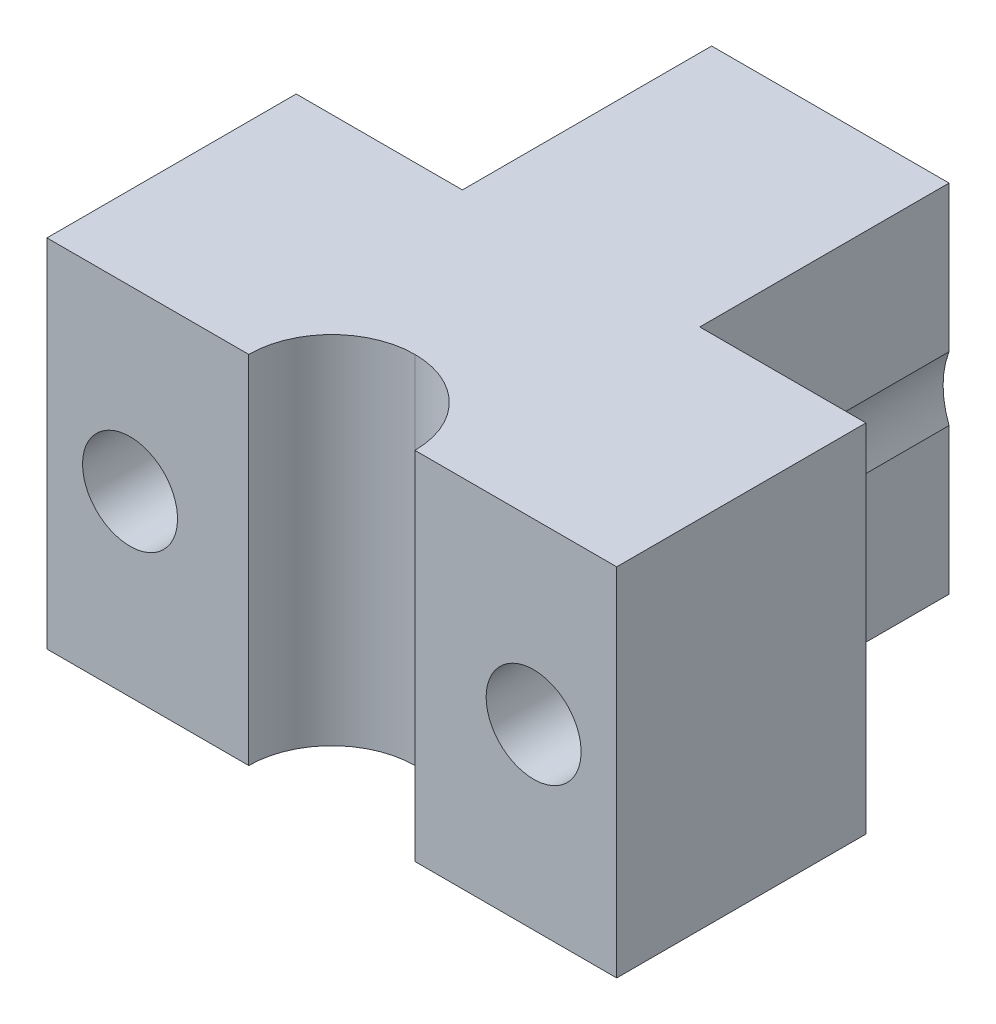
ISO-10303-21;
HEADER;
FILE_DESCRIPTION(('STEP AP214'),'2;1');
FILE_NAME('part.step','',(''),(''),'','','');
FILE_SCHEMA(('AUTOMOTIVE_DESIGN { 1 0 10303 214 1 1 1 1 }'));
ENDSEC;
DATA;
#1=APPLICATION_CONTEXT('core data for automotive mechanical design processes');
#2=APPLICATION_PROTOCOL_DEFINITION('international standard','automotive_design',2000,#1);
#3=PRODUCT_CONTEXT('',#1,'mechanical');
#4=PRODUCT('Part','Part','',(#3));
#5=PRODUCT_RELATED_PRODUCT_CATEGORY('part','',(#4));
#6=PRODUCT_DEFINITION_FORMATION('','',#4);
#7=PRODUCT_DEFINITION_CONTEXT('part definition',#1,'design');
#8=PRODUCT_DEFINITION('design','',#6,#7);
#9=PRODUCT_DEFINITION_SHAPE('','',#8);
#10=(LENGTH_UNIT() NAMED_UNIT(*) SI_UNIT(.MILLI.,.METRE.));
#11=(NAMED_UNIT(*) PLANE_ANGLE_UNIT() SI_UNIT($,.RADIAN.));
#12=(NAMED_UNIT(*) SI_UNIT($,.STERADIAN.) SOLID_ANGLE_UNIT());
#13=UNCERTAINTY_MEASURE_WITH_UNIT(LENGTH_MEASURE(1.E-05),#10,'distance_accuracy_value','');
#14=(GEOMETRIC_REPRESENTATION_CONTEXT(3) GLOBAL_UNCERTAINTY_ASSIGNED_CONTEXT((#13)) GLOBAL_UNIT_ASSIGNED_CONTEXT((#10,
#11,#12)) REPRESENTATION_CONTEXT('',''));
#15=CARTESIAN_POINT('',(0.,0.,0.));
#16=DIRECTION('',(0.,0.,1.));
#17=DIRECTION('',(1.,0.,0.));
#18=AXIS2_PLACEMENT_3D('',#15,#16,#17);
#19=CARTESIAN_POINT('',(-10.,0.,0.));
#20=DIRECTION('',(1.,0.,0.));
#21=DIRECTION('',(0.,0.,-1.));
#22=AXIS2_PLACEMENT_3D('',#19,#20,#21);
#23=PLANE('',#22);
#24=DIRECTION('',(0.,0.,1.));
#25=VECTOR('',#24,1.);
#26=CARTESIAN_POINT('',(-10.,17.6925824035673,-32.));
#27=LINE('',#26,#25);
#28=CARTESIAN_POINT('',(-10.,17.6925824035673,-11.));
#29=VERTEX_POINT('',#28);
#30=CARTESIAN_POINT('',(-10.,17.6925824035673,-16.3));
#31=VERTEX_POINT('',#30);
#32=EDGE_CURVE('E11',#29,#31,#27,.F.);
#33=ORIENTED_EDGE('',*,*,#32,.F.);
#34=DIRECTION('',(0.,1.,0.));
#35=VECTOR('',#34,1.);
#36=CARTESIAN_POINT('',(-10.,0.,-11.));
#37=LINE('',#36,#35);
#38=CARTESIAN_POINT('',(-10.,30.,-11.));
#39=VERTEX_POINT('',#38);
#40=EDGE_CURVE('E186',#29,#39,#37,.T.);
#41=ORIENTED_EDGE('',*,*,#40,.T.);
#42=DIRECTION('',(0.,0.,-1.));
#43=VECTOR('',#42,1.);
#44=CARTESIAN_POINT('',(-10.,30.,-11.));
#45=LINE('',#44,#43);
#46=CARTESIAN_POINT('',(-10.,30.,-32.));
#47=VERTEX_POINT('',#46);
#48=EDGE_CURVE('E198',#39,#47,#45,.T.);
#49=ORIENTED_EDGE('',*,*,#48,.T.);
#50=DIRECTION('',(0.,-1.,0.));
#51=VECTOR('',#50,1.);
#52=CARTESIAN_POINT('',(-10.,0.,-32.));
#53=LINE('',#52,#51);
#54=CARTESIAN_POINT('',(-10.,17.6925824035673,-32.));
#55=VERTEX_POINT('',#54);
#56=EDGE_CURVE('E206',#47,#55,#53,.T.);
#57=ORIENTED_EDGE('',*,*,#56,.T.);
#58=CARTESIAN_POINT('',(-10.,17.6925824035673,-26.7));
#59=VERTEX_POINT('',#58);
#60=EDGE_CURVE('E41',#59,#55,#27,.F.);
#61=ORIENTED_EDGE('',*,*,#60,.F.);
#62=DIRECTION('',(0.,-1.,0.));
#63=VECTOR('',#62,1.);
#64=CARTESIAN_POINT('',(-10.,4.8,-26.7));
#65=LINE('',#64,#63);
#66=CARTESIAN_POINT('',(-10.,25.2,-26.7));
#67=VERTEX_POINT('',#66);
#68=EDGE_CURVE('E352',#67,#59,#65,.T.);
#69=ORIENTED_EDGE('',*,*,#68,.F.);
#70=DIRECTION('',(0.,0.,-1.));
#71=VECTOR('',#70,1.);
#72=CARTESIAN_POINT('',(-10.,25.2,-16.3));
#73=LINE('',#72,#71);
#74=CARTESIAN_POINT('',(-10.,25.2,-16.3));
#75=VERTEX_POINT('',#74);
#76=EDGE_CURVE('E348',#75,#67,#73,.T.);
#77=ORIENTED_EDGE('',*,*,#76,.F.);
#78=DIRECTION('',(0.,1.,0.));
#79=VECTOR('',#78,1.);
#80=CARTESIAN_POINT('',(-10.,4.80000000000001,-16.3));
#81=LINE('',#80,#79);
#82=EDGE_CURVE('E189',#31,#75,#81,.T.);
#83=ORIENTED_EDGE('',*,*,#82,.F.);
#84=EDGE_LOOP('',(#33,#41,#49,#57,#61,#69,#77,#83));
#85=FACE_BOUND('',#84,.T.);
#86=ADVANCED_FACE('F37',(#85),#23,.F.);
#87=DIRECTION('',(0.,0.,1.));
#88=VECTOR('',#87,1.);
#89=CARTESIAN_POINT('',(-10.,12.3074175964327,-32.));
#90=LINE('',#89,#88);
#91=CARTESIAN_POINT('',(-10.,12.3074175964327,-32.));
#92=VERTEX_POINT('',#91);
#93=CARTESIAN_POINT('',(-10.,12.3074175964327,-26.7));
#94=VERTEX_POINT('',#93);
#95=EDGE_CURVE('E287',#92,#94,#90,.T.);
#96=ORIENTED_EDGE('',*,*,#95,.F.);
#97=CARTESIAN_POINT('',(-10.,0.,-32.));
#98=VERTEX_POINT('',#97);
#99=EDGE_CURVE('E205',#92,#98,#53,.T.);
#100=ORIENTED_EDGE('',*,*,#99,.T.);
#101=DIRECTION('',(0.,0.,1.));
#102=VECTOR('',#101,1.);
#103=CARTESIAN_POINT('',(-10.,0.,-11.));
#104=LINE('',#103,#102);
#105=CARTESIAN_POINT('',(-10.,0.,-11.));
#106=VERTEX_POINT('',#105);
#107=EDGE_CURVE('E196',#98,#106,#104,.T.);
#108=ORIENTED_EDGE('',*,*,#107,.T.);
#109=CARTESIAN_POINT('',(-10.,12.3074175964327,-11.));
#110=VERTEX_POINT('',#109);
#111=EDGE_CURVE('E195',#106,#110,#37,.T.);
#112=ORIENTED_EDGE('',*,*,#111,.T.);
#113=CARTESIAN_POINT('',(-10.,12.3074175964327,-16.3));
#114=VERTEX_POINT('',#113);
#115=EDGE_CURVE('E181',#114,#110,#90,.T.);
#116=ORIENTED_EDGE('',*,*,#115,.F.);
#117=CARTESIAN_POINT('',(-10.,4.80000000000001,-16.3));
#118=VERTEX_POINT('',#117);
#119=EDGE_CURVE('E345',#118,#114,#81,.T.);
#120=ORIENTED_EDGE('',*,*,#119,.F.);
#121=DIRECTION('',(0.,0.,1.));
#122=VECTOR('',#121,1.);
#123=CARTESIAN_POINT('',(-10.,4.80000000000001,-16.3));
#124=LINE('',#123,#122);
#125=CARTESIAN_POINT('',(-10.,4.8,-26.7));
#126=VERTEX_POINT('',#125);
#127=EDGE_CURVE('E340',#126,#118,#124,.T.);
#128=ORIENTED_EDGE('',*,*,#127,.F.);
#129=EDGE_CURVE('E351',#94,#126,#65,.T.);
#130=ORIENTED_EDGE('',*,*,#129,.F.);
#131=EDGE_LOOP('',(#96,#100,#108,#112,#116,#120,#128,#130));
#132=FACE_BOUND('',#131,.T.);
#133=ADVANCED_FACE('F373',(#132),#23,.F.);
#134=CARTESIAN_POINT('',(10.,0.,0.));
#135=DIRECTION('',(1.,0.,0.));
#136=DIRECTION('',(0.,0.,-1.));
#137=AXIS2_PLACEMENT_3D('',#134,#135,#136);
#138=PLANE('',#137);
#139=DIRECTION('',(0.,-1.,0.));
#140=VECTOR('',#139,1.);
#141=CARTESIAN_POINT('',(10.,0.,-11.));
#142=LINE('',#141,#140);
#143=CARTESIAN_POINT('',(10.,30.,-11.));
#144=VERTEX_POINT('',#143);
#145=CARTESIAN_POINT('',(10.,17.6925824035672,-11.));
#146=VERTEX_POINT('',#145);
#147=EDGE_CURVE('E225',#144,#146,#142,.T.);
#148=ORIENTED_EDGE('',*,*,#147,.T.);
#149=DIRECTION('',(0.,0.,1.));
#150=VECTOR('',#149,1.);
#151=CARTESIAN_POINT('',(10.,17.6925824035672,-32.));
#152=LINE('',#151,#150);
#153=CARTESIAN_POINT('',(10.,17.6925824035672,-32.));
#154=VERTEX_POINT('',#153);
#155=EDGE_CURVE('E285',#146,#154,#152,.F.);
#156=ORIENTED_EDGE('',*,*,#155,.T.);
#157=DIRECTION('',(0.,1.,0.));
#158=VECTOR('',#157,1.);
#159=CARTESIAN_POINT('',(10.,0.,-32.));
#160=LINE('',#159,#158);
#161=CARTESIAN_POINT('',(10.,30.,-32.));
#162=VERTEX_POINT('',#161);
#163=EDGE_CURVE('E218',#154,#162,#160,.T.);
#164=ORIENTED_EDGE('',*,*,#163,.T.);
#165=DIRECTION('',(0.,0.,1.));
#166=VECTOR('',#165,1.);
#167=CARTESIAN_POINT('',(10.,30.,-11.));
#168=LINE('',#167,#166);
#169=EDGE_CURVE('E222',#162,#144,#168,.T.);
#170=ORIENTED_EDGE('',*,*,#169,.T.);
#171=EDGE_LOOP('',(#148,#156,#164,#170));
#172=FACE_BOUND('',#171,.T.);
#173=ADVANCED_FACE('F312',(#172),#138,.T.);
#174=CARTESIAN_POINT('',(10.,0.,-32.));
#175=VERTEX_POINT('',#174);
#176=CARTESIAN_POINT('',(10.,12.3074175964328,-32.));
#177=VERTEX_POINT('',#176);
#178=EDGE_CURVE('E219',#175,#177,#160,.T.);
#179=ORIENTED_EDGE('',*,*,#178,.T.);
#180=DIRECTION('',(0.,0.,1.));
#181=VECTOR('',#180,1.);
#182=CARTESIAN_POINT('',(10.,12.3074175964328,-32.));
#183=LINE('',#182,#181);
#184=CARTESIAN_POINT('',(10.,12.3074175964328,-11.));
#185=VERTEX_POINT('',#184);
#186=EDGE_CURVE('E277',#177,#185,#183,.T.);
#187=ORIENTED_EDGE('',*,*,#186,.T.);
#188=CARTESIAN_POINT('',(10.,0.,-11.));
#189=VERTEX_POINT('',#188);
#190=EDGE_CURVE('E224',#185,#189,#142,.T.);
#191=ORIENTED_EDGE('',*,*,#190,.T.);
#192=DIRECTION('',(0.,0.,-1.));
#193=VECTOR('',#192,1.);
#194=CARTESIAN_POINT('',(10.,0.,-11.));
#195=LINE('',#194,#193);
#196=EDGE_CURVE('E215',#189,#175,#195,.T.);
#197=ORIENTED_EDGE('',*,*,#196,.T.);
#198=EDGE_LOOP('',(#179,#187,#191,#197));
#199=FACE_BOUND('',#198,.T.);
#200=ADVANCED_FACE('F412',(#199),#138,.T.);
#201=CARTESIAN_POINT('',(24.,4.80000000000001,-16.3));
#202=DIRECTION('',(0.,-1.,0.));
#203=DIRECTION('',(0.,0.,-1.));
#204=AXIS2_PLACEMENT_3D('',#201,#202,#203);
#205=PLANE('',#204);
#206=DIRECTION('',(0.,0.,-1.));
#207=VECTOR('',#206,1.);
#208=CARTESIAN_POINT('',(6.,4.8,-26.7));
#209=LINE('',#208,#207);
#210=CARTESIAN_POINT('',(6.,4.80000000000001,-16.3));
#211=VERTEX_POINT('',#210);
#212=CARTESIAN_POINT('',(6.,4.8,-26.7));
#213=VERTEX_POINT('',#212);
#214=EDGE_CURVE('E320',#211,#213,#209,.T.);
#215=ORIENTED_EDGE('',*,*,#214,.T.);
#216=DIRECTION('',(-1.,0.,0.));
#217=VECTOR('',#216,1.);
#218=CARTESIAN_POINT('',(24.,4.8,-26.7));
#219=LINE('',#218,#217);
#220=EDGE_CURVE('E211',#213,#126,#219,.T.);
#221=ORIENTED_EDGE('',*,*,#220,.T.);
#222=ORIENTED_EDGE('',*,*,#127,.T.);
#223=DIRECTION('',(-1.,0.,0.));
#224=VECTOR('',#223,1.);
#225=CARTESIAN_POINT('',(24.,4.80000000000001,-16.3));
#226=LINE('',#225,#224);
#227=EDGE_CURVE('E354',#211,#118,#226,.T.);
#228=ORIENTED_EDGE('',*,*,#227,.F.);
#229=EDGE_LOOP('',(#215,#221,#222,#228));
#230=FACE_BOUND('',#229,.T.);
#231=ADVANCED_FACE('F369',(#230),#205,.F.);
#232=CARTESIAN_POINT('',(24.,4.8,-26.7));
#233=DIRECTION('',(0.,0.,-1.));
#234=DIRECTION('',(-1.,0.,0.));
#235=AXIS2_PLACEMENT_3D('',#232,#233,#234);
#236=PLANE('',#235);
#237=CARTESIAN_POINT('',(-17.,15.,-26.7));
#238=DIRECTION('',(0.,0.,-1.));
#239=DIRECTION('',(-1.,0.,0.));
#240=AXIS2_PLACEMENT_3D('',#237,#238,#239);
#241=CIRCLE('',#240,7.5);
#242=EDGE_CURVE('E291',#94,#59,#241,.F.);
#243=ORIENTED_EDGE('',*,*,#242,.F.);
#244=ORIENTED_EDGE('',*,*,#129,.T.);
#245=ORIENTED_EDGE('',*,*,#220,.F.);
#246=DIRECTION('',(0.,1.,0.));
#247=VECTOR('',#246,1.);
#248=CARTESIAN_POINT('',(6.,4.8,-26.7));
#249=LINE('',#248,#247);
#250=CARTESIAN_POINT('',(6.,25.2,-26.7));
#251=VERTEX_POINT('',#250);
#252=EDGE_CURVE('E327',#213,#251,#249,.T.);
#253=ORIENTED_EDGE('',*,*,#252,.T.);
#254=DIRECTION('',(-1.,0.,0.));
#255=VECTOR('',#254,1.);
#256=CARTESIAN_POINT('',(24.,25.2,-26.7));
#257=LINE('',#256,#255);
#258=EDGE_CURVE('E357',#251,#67,#257,.T.);
#259=ORIENTED_EDGE('',*,*,#258,.T.);
#260=ORIENTED_EDGE('',*,*,#68,.T.);
#261=EDGE_LOOP('',(#243,#244,#245,#253,#259,#260));
#262=FACE_BOUND('',#261,.T.);
#263=ADVANCED_FACE('F419',(#262),#236,.F.);
#264=CARTESIAN_POINT('',(24.,25.2,-16.3));
#265=DIRECTION('',(0.,1.,0.));
#266=DIRECTION('',(0.,0.,1.));
#267=AXIS2_PLACEMENT_3D('',#264,#265,#266);
#268=PLANE('',#267);
#269=DIRECTION('',(0.,0.,1.));
#270=VECTOR('',#269,1.);
#271=CARTESIAN_POINT('',(6.,25.2,-26.7));
#272=LINE('',#271,#270);
#273=CARTESIAN_POINT('',(6.,25.2,-16.3));
#274=VERTEX_POINT('',#273);
#275=EDGE_CURVE('E282',#251,#274,#272,.T.);
#276=ORIENTED_EDGE('',*,*,#275,.T.);
#277=DIRECTION('',(-1.,0.,0.));
#278=VECTOR('',#277,1.);
#279=CARTESIAN_POINT('',(24.,25.2,-16.3));
#280=LINE('',#279,#278);
#281=EDGE_CURVE('E359',#274,#75,#280,.T.);
#282=ORIENTED_EDGE('',*,*,#281,.T.);
#283=ORIENTED_EDGE('',*,*,#76,.T.);
#284=ORIENTED_EDGE('',*,*,#258,.F.);
#285=EDGE_LOOP('',(#276,#282,#283,#284));
#286=FACE_BOUND('',#285,.T.);
#287=ADVANCED_FACE('F474',(#286),#268,.F.);
#288=CARTESIAN_POINT('',(24.,4.80000000000001,-16.3));
#289=DIRECTION('',(0.,0.,1.));
#290=DIRECTION('',(1.,0.,0.));
#291=AXIS2_PLACEMENT_3D('',#288,#289,#290);
#292=PLANE('',#291);
#293=CARTESIAN_POINT('',(-17.,15.,-16.3));
#294=DIRECTION('',(0.,0.,1.));
#295=DIRECTION('',(1.,0.,0.));
#296=AXIS2_PLACEMENT_3D('',#293,#294,#295);
#297=CIRCLE('',#296,7.5);
#298=EDGE_CURVE('E300',#31,#114,#297,.F.);
#299=ORIENTED_EDGE('',*,*,#298,.F.);
#300=ORIENTED_EDGE('',*,*,#82,.T.);
#301=ORIENTED_EDGE('',*,*,#281,.F.);
#302=DIRECTION('',(0.,-1.,0.));
#303=VECTOR('',#302,1.);
#304=CARTESIAN_POINT('',(6.,4.8,-16.3));
#305=LINE('',#304,#303);
#306=EDGE_CURVE('E318',#274,#211,#305,.T.);
#307=ORIENTED_EDGE('',*,*,#306,.T.);
#308=ORIENTED_EDGE('',*,*,#227,.T.);
#309=ORIENTED_EDGE('',*,*,#119,.T.);
#310=EDGE_LOOP('',(#299,#300,#301,#307,#308,#309));
#311=FACE_BOUND('',#310,.T.);
#312=ADVANCED_FACE('F363',(#311),#292,.F.);
#313=CARTESIAN_POINT('',(-24.,0.,-32.));
#314=DIRECTION('',(0.,0.,1.));
#315=DIRECTION('',(1.,0.,0.));
#316=AXIS2_PLACEMENT_3D('',#313,#314,#315);
#317=PLANE('',#316);
#318=CARTESIAN_POINT('',(-17.,15.,-32.));
#319=DIRECTION('',(0.,0.,-1.));
#320=DIRECTION('',(-1.,0.,0.));
#321=AXIS2_PLACEMENT_3D('',#318,#319,#320);
#322=CIRCLE('',#321,7.5);
#323=EDGE_CURVE('E52',#55,#92,#322,.T.);
#324=ORIENTED_EDGE('',*,*,#323,.F.);
#325=ORIENTED_EDGE('',*,*,#56,.F.);
#326=DIRECTION('',(1.,0.,0.));
#327=VECTOR('',#326,1.);
#328=CARTESIAN_POINT('',(-24.,30.,-32.));
#329=LINE('',#328,#327);
#330=EDGE_CURVE('E235',#47,#162,#329,.T.);
#331=ORIENTED_EDGE('',*,*,#330,.T.);
#332=ORIENTED_EDGE('',*,*,#163,.F.);
#333=CARTESIAN_POINT('',(17.,15.,-32.));
#334=DIRECTION('',(0.,0.,-1.));
#335=DIRECTION('',(-1.,0.,0.));
#336=AXIS2_PLACEMENT_3D('',#333,#334,#335);
#337=CIRCLE('',#336,7.5);
#338=EDGE_CURVE('E310',#177,#154,#337,.T.);
#339=ORIENTED_EDGE('',*,*,#338,.F.);
#340=ORIENTED_EDGE('',*,*,#178,.F.);
#341=DIRECTION('',(1.,0.,0.));
#342=VECTOR('',#341,1.);
#343=CARTESIAN_POINT('',(-24.,0.,-32.));
#344=LINE('',#343,#342);
#345=EDGE_CURVE('E233',#98,#175,#344,.T.);
#346=ORIENTED_EDGE('',*,*,#345,.F.);
#347=ORIENTED_EDGE('',*,*,#99,.F.);
#348=EDGE_LOOP('',(#324,#325,#331,#332,#339,#340,#346,#347));
#349=FACE_BOUND('',#348,.T.);
#350=ADVANCED_FACE('F297',(#349),#317,.F.);
#351=CARTESIAN_POINT('',(-24.,30.,10.));
#352=DIRECTION('',(0.,0.,-1.));
#353=DIRECTION('',(-1.,0.,0.));
#354=AXIS2_PLACEMENT_3D('',#351,#352,#353);
#355=PLANE('',#354);
#356=CARTESIAN_POINT('',(17.,15.,10.));
#357=DIRECTION('',(0.,0.,-1.));
#358=DIRECTION('',(-1.,0.,0.));
#359=AXIS2_PLACEMENT_3D('',#356,#357,#358);
#360=CIRCLE('',#359,4.);
#361=CARTESIAN_POINT('',(13.,15.,10.));
#362=VERTEX_POINT('',#361);
#363=EDGE_CURVE('E331',#362,#362,#360,.T.);
#364=ORIENTED_EDGE('',*,*,#363,.T.);
#365=EDGE_LOOP('',(#364));
#366=FACE_BOUND('',#365,.T.);
#367=DIRECTION('',(1.,0.,0.));
#368=VECTOR('',#367,1.);
#369=CARTESIAN_POINT('',(-24.,30.,10.));
#370=LINE('',#369,#368);
#371=CARTESIAN_POINT('',(7.,30.,10.));
#372=VERTEX_POINT('',#371);
#373=CARTESIAN_POINT('',(24.,30.,10.));
#374=VERTEX_POINT('',#373);
#375=EDGE_CURVE('E252',#372,#374,#370,.T.);
#376=ORIENTED_EDGE('',*,*,#375,.F.);
#377=DIRECTION('',(0.,1.,0.));
#378=VECTOR('',#377,1.);
#379=CARTESIAN_POINT('',(7.,0.,10.));
#380=LINE('',#379,#378);
#381=CARTESIAN_POINT('',(7.,0.,10.));
#382=VERTEX_POINT('',#381);
#383=EDGE_CURVE('E242',#382,#372,#380,.T.);
#384=ORIENTED_EDGE('',*,*,#383,.F.);
#385=DIRECTION('',(1.,0.,0.));
#386=VECTOR('',#385,1.);
#387=CARTESIAN_POINT('',(-24.,0.,10.));
#388=LINE('',#387,#386);
#389=CARTESIAN_POINT('',(24.,0.,10.));
#390=VERTEX_POINT('',#389);
#391=EDGE_CURVE('E261',#382,#390,#388,.T.);
#392=ORIENTED_EDGE('',*,*,#391,.T.);
#393=DIRECTION('',(0.,-1.,0.));
#394=VECTOR('',#393,1.);
#395=CARTESIAN_POINT('',(24.,30.,10.));
#396=LINE('',#395,#394);
#397=EDGE_CURVE('E256',#374,#390,#396,.T.);
#398=ORIENTED_EDGE('',*,*,#397,.F.);
#399=EDGE_LOOP('',(#376,#384,#392,#398));
#400=FACE_BOUND('',#399,.T.);
#401=ADVANCED_FACE('F398',(#366,#400),#355,.F.);
#402=CARTESIAN_POINT('',(24.,30.,10.));
#403=DIRECTION('',(-1.,0.,0.));
#404=DIRECTION('',(0.,0.,1.));
#405=AXIS2_PLACEMENT_3D('',#402,#403,#404);
#406=PLANE('',#405);
#407=DIRECTION('',(0.,0.,-1.));
#408=VECTOR('',#407,1.);
#409=CARTESIAN_POINT('',(24.,0.,10.));
#410=LINE('',#409,#408);
#411=CARTESIAN_POINT('',(24.,0.,-11.));
#412=VERTEX_POINT('',#411);
#413=EDGE_CURVE('E245',#390,#412,#410,.T.);
#414=ORIENTED_EDGE('',*,*,#413,.T.);
#415=DIRECTION('',(0.,-1.,0.));
#416=VECTOR('',#415,1.);
#417=CARTESIAN_POINT('',(24.,0.,-11.));
#418=LINE('',#417,#416);
#419=CARTESIAN_POINT('',(24.,30.,-11.));
#420=VERTEX_POINT('',#419);
#421=EDGE_CURVE('E213',#420,#412,#418,.T.);
#422=ORIENTED_EDGE('',*,*,#421,.F.);
#423=DIRECTION('',(0.,0.,-1.));
#424=VECTOR('',#423,1.);
#425=CARTESIAN_POINT('',(24.,30.,10.));
#426=LINE('',#425,#424);
#427=EDGE_CURVE('E246',#374,#420,#426,.T.);
#428=ORIENTED_EDGE('',*,*,#427,.F.);
#429=ORIENTED_EDGE('',*,*,#397,.T.);
#430=EDGE_LOOP('',(#414,#422,#428,#429));
#431=FACE_BOUND('',#430,.T.);
#432=ADVANCED_FACE('F405',(#431),#406,.F.);
#433=CARTESIAN_POINT('',(-24.,30.,10.));
#434=DIRECTION('',(1.,0.,0.));
#435=DIRECTION('',(0.,0.,-1.));
#436=AXIS2_PLACEMENT_3D('',#433,#434,#435);
#437=PLANE('',#436);
#438=DIRECTION('',(0.,0.,1.));
#439=VECTOR('',#438,1.);
#440=CARTESIAN_POINT('',(-24.,30.,10.));
#441=LINE('',#440,#439);
#442=CARTESIAN_POINT('',(-24.,30.,-11.));
#443=VERTEX_POINT('',#442);
#444=CARTESIAN_POINT('',(-24.,30.,10.));
#445=VERTEX_POINT('',#444);
#446=EDGE_CURVE('E249',#443,#445,#441,.T.);
#447=ORIENTED_EDGE('',*,*,#446,.F.);
#448=DIRECTION('',(0.,1.,0.));
#449=VECTOR('',#448,1.);
#450=CARTESIAN_POINT('',(-24.,0.,-11.));
#451=LINE('',#450,#449);
#452=CARTESIAN_POINT('',(-24.,0.,-11.));
#453=VERTEX_POINT('',#452);
#454=EDGE_CURVE('E200',#453,#443,#451,.T.);
#455=ORIENTED_EDGE('',*,*,#454,.F.);
#456=DIRECTION('',(0.,0.,1.));
#457=VECTOR('',#456,1.);
#458=CARTESIAN_POINT('',(-24.,0.,10.));
#459=LINE('',#458,#457);
#460=CARTESIAN_POINT('',(-24.,0.,10.));
#461=VERTEX_POINT('',#460);
#462=EDGE_CURVE('E259',#453,#461,#459,.T.);
#463=ORIENTED_EDGE('',*,*,#462,.T.);
#464=DIRECTION('',(0.,-1.,0.));
#465=VECTOR('',#464,1.);
#466=CARTESIAN_POINT('',(-24.,30.,10.));
#467=LINE('',#466,#465);
#468=EDGE_CURVE('E266',#445,#461,#467,.T.);
#469=ORIENTED_EDGE('',*,*,#468,.F.);
#470=EDGE_LOOP('',(#447,#455,#463,#469));
#471=FACE_BOUND('',#470,.T.);
#472=ADVANCED_FACE('F380',(#471),#437,.F.);
#473=CARTESIAN_POINT('',(-17.,15.,10.));
#474=DIRECTION('',(0.,0.,-1.));
#475=DIRECTION('',(-1.,0.,0.));
#476=AXIS2_PLACEMENT_3D('',#473,#474,#475);
#477=CIRCLE('',#476,4.);
#478=CARTESIAN_POINT('',(-21.,15.,10.));
#479=VERTEX_POINT('',#478);
#480=EDGE_CURVE('E337',#479,#479,#477,.T.);
#481=ORIENTED_EDGE('',*,*,#480,.T.);
#482=EDGE_LOOP('',(#481));
#483=FACE_BOUND('',#482,.T.);
#484=CARTESIAN_POINT('',(-7.,0.,10.));
#485=VERTEX_POINT('',#484);
#486=EDGE_CURVE('E250',#461,#485,#388,.T.);
#487=ORIENTED_EDGE('',*,*,#486,.T.);
#488=DIRECTION('',(0.,-1.,0.));
#489=VECTOR('',#488,1.);
#490=CARTESIAN_POINT('',(-7.00000000000001,30.,10.));
#491=LINE('',#490,#489);
#492=CARTESIAN_POINT('',(-7.00000000000001,30.,10.));
#493=VERTEX_POINT('',#492);
#494=EDGE_CURVE('E238',#493,#485,#491,.T.);
#495=ORIENTED_EDGE('',*,*,#494,.F.);
#496=EDGE_CURVE('E253',#445,#493,#370,.T.);
#497=ORIENTED_EDGE('',*,*,#496,.F.);
#498=ORIENTED_EDGE('',*,*,#468,.T.);
#499=EDGE_LOOP('',(#487,#495,#497,#498));
#500=FACE_BOUND('',#499,.T.);
#501=ADVANCED_FACE('F387',(#483,#500),#355,.F.);
#502=CARTESIAN_POINT('',(0.,30.,0.));
#503=DIRECTION('',(0.,-1.,0.));
#504=DIRECTION('',(0.,0.,-1.));
#505=AXIS2_PLACEMENT_3D('',#502,#503,#504);
#506=PLANE('',#505);
#507=ORIENTED_EDGE('',*,*,#48,.F.);
#508=DIRECTION('',(-1.,0.,0.));
#509=VECTOR('',#508,1.);
#510=CARTESIAN_POINT('',(-10.,30.,-11.));
#511=LINE('',#510,#509);
#512=EDGE_CURVE('E193',#39,#443,#511,.T.);
#513=ORIENTED_EDGE('',*,*,#512,.T.);
#514=ORIENTED_EDGE('',*,*,#446,.T.);
#515=ORIENTED_EDGE('',*,*,#496,.T.);
#516=CARTESIAN_POINT('',(0.,30.,10.));
#517=DIRECTION('',(0.,-1.,0.));
#518=DIRECTION('',(0.,0.,-1.));
#519=AXIS2_PLACEMENT_3D('',#516,#517,#518);
#520=CIRCLE('',#519,7.);
#521=CARTESIAN_POINT('',(0.,30.,3.));
#522=VERTEX_POINT('',#521);
#523=EDGE_CURVE('E271',#493,#522,#520,.T.);
#524=ORIENTED_EDGE('',*,*,#523,.T.);
#525=CARTESIAN_POINT('',(0.,30.,10.));
#526=DIRECTION('',(0.,-1.,0.));
#527=DIRECTION('',(0.,0.,-1.));
#528=AXIS2_PLACEMENT_3D('',#525,#526,#527);
#529=CIRCLE('',#528,7.);
#530=EDGE_CURVE('E273',#522,#372,#529,.T.);
#531=ORIENTED_EDGE('',*,*,#530,.T.);
#532=ORIENTED_EDGE('',*,*,#375,.T.);
#533=ORIENTED_EDGE('',*,*,#427,.T.);
#534=DIRECTION('',(1.,0.,0.));
#535=VECTOR('',#534,1.);
#536=CARTESIAN_POINT('',(10.,30.,-11.));
#537=LINE('',#536,#535);
#538=EDGE_CURVE('E228',#144,#420,#537,.T.);
#539=ORIENTED_EDGE('',*,*,#538,.F.);
#540=ORIENTED_EDGE('',*,*,#169,.F.);
#541=ORIENTED_EDGE('',*,*,#330,.F.);
#542=EDGE_LOOP('',(#507,#513,#514,#515,#524,#531,#532,#533,#539,#540,#541));
#543=FACE_BOUND('',#542,.T.);
#544=ADVANCED_FACE('F303',(#543),#506,.F.);
#545=CARTESIAN_POINT('',(0.,0.,0.));
#546=DIRECTION('',(0.,-1.,0.));
#547=DIRECTION('',(0.,0.,-1.));
#548=AXIS2_PLACEMENT_3D('',#545,#546,#547);
#549=PLANE('',#548);
#550=DIRECTION('',(-1.,0.,0.));
#551=VECTOR('',#550,1.);
#552=CARTESIAN_POINT('',(-10.,0.,-11.));
#553=LINE('',#552,#551);
#554=EDGE_CURVE('E209',#106,#453,#553,.T.);
#555=ORIENTED_EDGE('',*,*,#554,.F.);
#556=ORIENTED_EDGE('',*,*,#107,.F.);
#557=ORIENTED_EDGE('',*,*,#345,.T.);
#558=ORIENTED_EDGE('',*,*,#196,.F.);
#559=DIRECTION('',(1.,0.,0.));
#560=VECTOR('',#559,1.);
#561=CARTESIAN_POINT('',(10.,0.,-11.));
#562=LINE('',#561,#560);
#563=EDGE_CURVE('E230',#189,#412,#562,.T.);
#564=ORIENTED_EDGE('',*,*,#563,.T.);
#565=ORIENTED_EDGE('',*,*,#413,.F.);
#566=ORIENTED_EDGE('',*,*,#391,.F.);
#567=CARTESIAN_POINT('',(0.,0.,10.));
#568=DIRECTION('',(0.,-1.,0.));
#569=DIRECTION('',(0.,0.,-1.));
#570=AXIS2_PLACEMENT_3D('',#567,#568,#569);
#571=CIRCLE('',#570,7.);
#572=CARTESIAN_POINT('',(0.,0.,3.));
#573=VERTEX_POINT('',#572);
#574=EDGE_CURVE('E275',#382,#573,#571,.F.);
#575=ORIENTED_EDGE('',*,*,#574,.T.);
#576=CARTESIAN_POINT('',(0.,0.,10.));
#577=DIRECTION('',(0.,-1.,0.));
#578=DIRECTION('',(0.,0.,-1.));
#579=AXIS2_PLACEMENT_3D('',#576,#577,#578);
#580=CIRCLE('',#579,7.);
#581=EDGE_CURVE('E269',#573,#485,#580,.F.);
#582=ORIENTED_EDGE('',*,*,#581,.T.);
#583=ORIENTED_EDGE('',*,*,#486,.F.);
#584=ORIENTED_EDGE('',*,*,#462,.F.);
#585=EDGE_LOOP('',(#555,#556,#557,#558,#564,#565,#566,#575,#582,#583,#584));
#586=FACE_BOUND('',#585,.T.);
#587=ADVANCED_FACE('F383',(#586),#549,.T.);
#588=CARTESIAN_POINT('',(10.,0.,-11.));
#589=DIRECTION('',(0.,0.,1.));
#590=DIRECTION('',(0.,-1.,0.));
#591=AXIS2_PLACEMENT_3D('',#588,#589,#590);
#592=PLANE('',#591);
#593=ORIENTED_EDGE('',*,*,#190,.F.);
#594=CARTESIAN_POINT('',(17.,15.,-11.));
#595=DIRECTION('',(0.,0.,-1.));
#596=DIRECTION('',(-1.,0.,0.));
#597=AXIS2_PLACEMENT_3D('',#594,#595,#596);
#598=CIRCLE('',#597,7.5);
#599=EDGE_CURVE('E317',#185,#146,#598,.T.);
#600=ORIENTED_EDGE('',*,*,#599,.T.);
#601=ORIENTED_EDGE('',*,*,#147,.F.);
#602=ORIENTED_EDGE('',*,*,#538,.T.);
#603=ORIENTED_EDGE('',*,*,#421,.T.);
#604=ORIENTED_EDGE('',*,*,#563,.F.);
#605=EDGE_LOOP('',(#593,#600,#601,#602,#603,#604));
#606=FACE_BOUND('',#605,.T.);
#607=CARTESIAN_POINT('',(17.,15.,-11.));
#608=DIRECTION('',(0.,0.,-1.));
#609=DIRECTION('',(-1.,0.,0.));
#610=AXIS2_PLACEMENT_3D('',#607,#608,#609);
#611=CIRCLE('',#610,4.);
#612=CARTESIAN_POINT('',(13.,15.,-11.));
#613=VERTEX_POINT('',#612);
#614=EDGE_CURVE('E281',#613,#613,#611,.T.);
#615=ORIENTED_EDGE('',*,*,#614,.F.);
#616=EDGE_LOOP('',(#615));
#617=FACE_BOUND('',#616,.T.);
#618=ADVANCED_FACE('F409',(#606,#617),#592,.F.);
#619=CARTESIAN_POINT('',(-10.,0.,-11.));
#620=DIRECTION('',(0.,0.,1.));
#621=DIRECTION('',(0.,-1.,0.));
#622=AXIS2_PLACEMENT_3D('',#619,#620,#621);
#623=PLANE('',#622);
#624=ORIENTED_EDGE('',*,*,#454,.T.);
#625=ORIENTED_EDGE('',*,*,#512,.F.);
#626=ORIENTED_EDGE('',*,*,#40,.F.);
#627=CARTESIAN_POINT('',(-17.,15.,-11.));
#628=DIRECTION('',(0.,0.,-1.));
#629=DIRECTION('',(-1.,0.,0.));
#630=AXIS2_PLACEMENT_3D('',#627,#628,#629);
#631=CIRCLE('',#630,7.5);
#632=EDGE_CURVE('E60',#29,#110,#631,.T.);
#633=ORIENTED_EDGE('',*,*,#632,.T.);
#634=ORIENTED_EDGE('',*,*,#111,.F.);
#635=ORIENTED_EDGE('',*,*,#554,.T.);
#636=EDGE_LOOP('',(#624,#625,#626,#633,#634,#635));
#637=FACE_BOUND('',#636,.T.);
#638=CARTESIAN_POINT('',(-17.,15.,-11.));
#639=DIRECTION('',(0.,0.,-1.));
#640=DIRECTION('',(-1.,0.,0.));
#641=AXIS2_PLACEMENT_3D('',#638,#639,#640);
#642=CIRCLE('',#641,4.);
#643=CARTESIAN_POINT('',(-21.,15.,-11.));
#644=VERTEX_POINT('',#643);
#645=EDGE_CURVE('E334',#644,#644,#642,.T.);
#646=ORIENTED_EDGE('',*,*,#645,.F.);
#647=EDGE_LOOP('',(#646));
#648=FACE_BOUND('',#647,.T.);
#649=ADVANCED_FACE('F190',(#637,#648),#623,.F.);
#650=CARTESIAN_POINT('',(-17.,15.,10.));
#651=DIRECTION('',(0.,0.,-1.));
#652=DIRECTION('',(-1.,0.,0.));
#653=AXIS2_PLACEMENT_3D('',#650,#651,#652);
#654=CYLINDRICAL_SURFACE('',#653,4.);
#655=ORIENTED_EDGE('',*,*,#480,.F.);
#656=EDGE_LOOP('',(#655));
#657=FACE_BOUND('',#656,.T.);
#658=ORIENTED_EDGE('',*,*,#645,.T.);
#659=EDGE_LOOP('',(#658));
#660=FACE_BOUND('',#659,.T.);
#661=ADVANCED_FACE('F430',(#657,#660),#654,.F.);
#662=CARTESIAN_POINT('',(17.,15.,10.));
#663=DIRECTION('',(0.,0.,-1.));
#664=DIRECTION('',(-1.,0.,0.));
#665=AXIS2_PLACEMENT_3D('',#662,#663,#664);
#666=CYLINDRICAL_SURFACE('',#665,4.);
#667=ORIENTED_EDGE('',*,*,#363,.F.);
#668=EDGE_LOOP('',(#667));
#669=FACE_BOUND('',#668,.T.);
#670=ORIENTED_EDGE('',*,*,#614,.T.);
#671=EDGE_LOOP('',(#670));
#672=FACE_BOUND('',#671,.T.);
#673=ADVANCED_FACE('F435',(#669,#672),#666,.F.);
#674=CARTESIAN_POINT('',(0.,0.,10.));
#675=DIRECTION('',(0.,1.,0.));
#676=DIRECTION('',(0.,0.,1.));
#677=AXIS2_PLACEMENT_3D('',#674,#675,#676);
#678=CYLINDRICAL_SURFACE('',#677,7.);
#679=ORIENTED_EDGE('',*,*,#383,.T.);
#680=ORIENTED_EDGE('',*,*,#530,.F.);
#681=DIRECTION('',(0.,1.,0.));
#682=VECTOR('',#681,1.);
#683=CARTESIAN_POINT('',(0.,0.,3.));
#684=LINE('',#683,#682);
#685=EDGE_CURVE('E278',#573,#522,#684,.T.);
#686=ORIENTED_EDGE('',*,*,#685,.F.);
#687=ORIENTED_EDGE('',*,*,#574,.F.);
#688=EDGE_LOOP('',(#679,#680,#686,#687));
#689=FACE_BOUND('',#688,.T.);
#690=ADVANCED_FACE('F39',(#689),#678,.F.);
#691=CARTESIAN_POINT('',(0.,0.,10.));
#692=DIRECTION('',(0.,-1.,0.));
#693=DIRECTION('',(1.,0.,0.));
#694=AXIS2_PLACEMENT_3D('',#691,#692,#693);
#695=CYLINDRICAL_SURFACE('',#694,7.);
#696=ORIENTED_EDGE('',*,*,#523,.F.);
#697=ORIENTED_EDGE('',*,*,#494,.T.);
#698=ORIENTED_EDGE('',*,*,#581,.F.);
#699=ORIENTED_EDGE('',*,*,#685,.T.);
#700=EDGE_LOOP('',(#696,#697,#698,#699));
#701=FACE_BOUND('',#700,.T.);
#702=ADVANCED_FACE('F390',(#701),#695,.F.);
#703=CARTESIAN_POINT('',(6.,0.,0.));
#704=DIRECTION('',(1.,0.,0.));
#705=DIRECTION('',(0.,0.,-1.));
#706=AXIS2_PLACEMENT_3D('',#703,#704,#705);
#707=PLANE('',#706);
#708=ORIENTED_EDGE('',*,*,#306,.F.);
#709=ORIENTED_EDGE('',*,*,#275,.F.);
#710=ORIENTED_EDGE('',*,*,#252,.F.);
#711=ORIENTED_EDGE('',*,*,#214,.F.);
#712=EDGE_LOOP('',(#708,#709,#710,#711));
#713=FACE_BOUND('',#712,.T.);
#714=ADVANCED_FACE('F454',(#713),#707,.F.);
#715=CARTESIAN_POINT('',(17.,15.,-32.));
#716=DIRECTION('',(0.,0.,1.));
#717=DIRECTION('',(1.,0.,0.));
#718=AXIS2_PLACEMENT_3D('',#715,#716,#717);
#719=CYLINDRICAL_SURFACE('',#718,7.5);
#720=ORIENTED_EDGE('',*,*,#599,.F.);
#721=ORIENTED_EDGE('',*,*,#186,.F.);
#722=ORIENTED_EDGE('',*,*,#338,.T.);
#723=ORIENTED_EDGE('',*,*,#155,.F.);
#724=EDGE_LOOP('',(#720,#721,#722,#723));
#725=FACE_BOUND('',#724,.T.);
#726=ADVANCED_FACE('F316',(#725),#719,.F.);
#727=CARTESIAN_POINT('',(-17.,15.,-32.));
#728=DIRECTION('',(0.,0.,1.));
#729=DIRECTION('',(1.,0.,0.));
#730=AXIS2_PLACEMENT_3D('',#727,#728,#729);
#731=CYLINDRICAL_SURFACE('',#730,7.5);
#732=ORIENTED_EDGE('',*,*,#32,.T.);
#733=ORIENTED_EDGE('',*,*,#298,.T.);
#734=ORIENTED_EDGE('',*,*,#115,.T.);
#735=ORIENTED_EDGE('',*,*,#632,.F.);
#736=EDGE_LOOP('',(#732,#733,#734,#735));
#737=FACE_BOUND('',#736,.T.);
#738=ADVANCED_FACE('F178',(#737),#731,.F.);
#739=ORIENTED_EDGE('',*,*,#60,.T.);
#740=ORIENTED_EDGE('',*,*,#323,.T.);
#741=ORIENTED_EDGE('',*,*,#95,.T.);
#742=ORIENTED_EDGE('',*,*,#242,.T.);
#743=EDGE_LOOP('',(#739,#740,#741,#742));
#744=FACE_BOUND('',#743,.T.);
#745=ADVANCED_FACE('F290',(#744),#731,.F.);
#746=CLOSED_SHELL('',(#86,#133,#173,#200,#231,#263,#287,#312,#350,#401,#432,#472,#501,#544,#587,
#618,#649,#661,#673,#690,#702,#714,#726,#738,#745));
#747=MANIFOLD_SOLID_BREP('B2',#746);
#748=ADVANCED_BREP_SHAPE_REPRESENTATION('',(#18,#747),#14);
#749=SHAPE_DEFINITION_REPRESENTATION(#9,#748);
ENDSEC;
END-ISO-10303-21;
